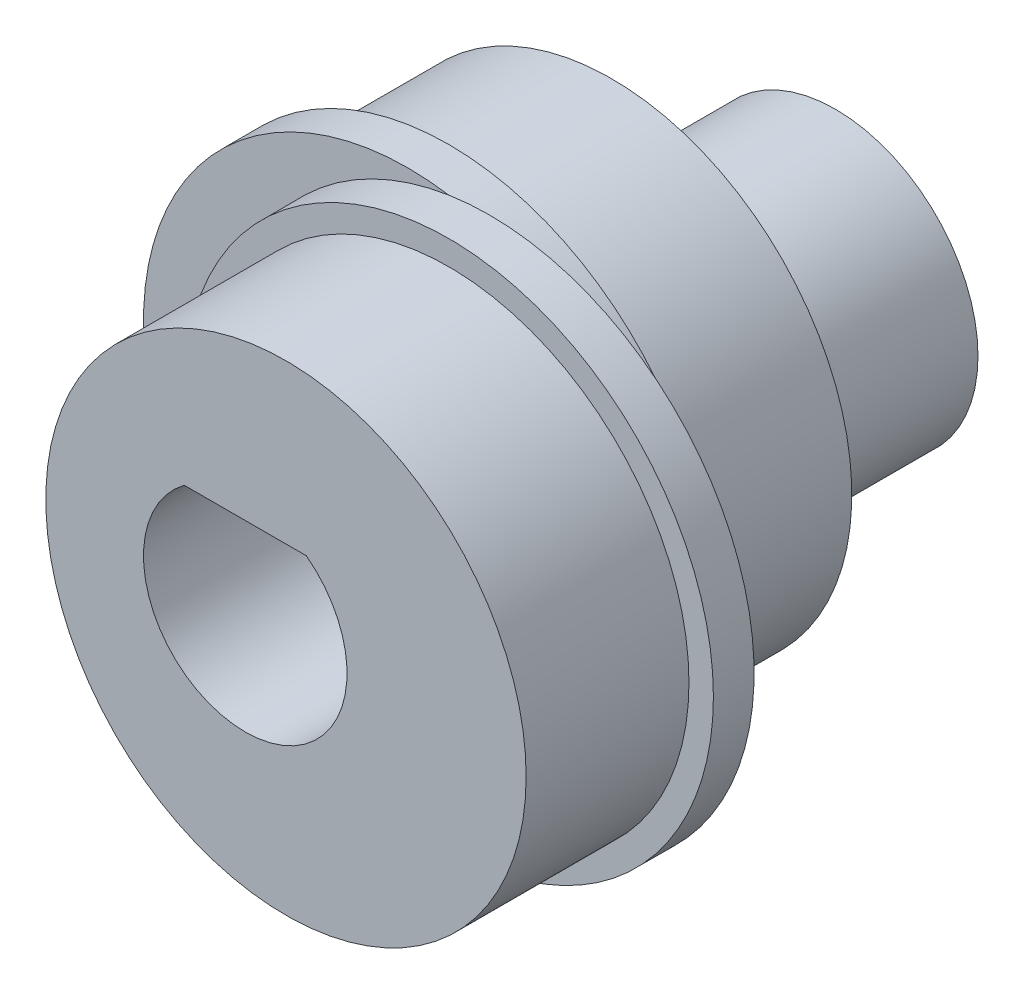
ISO-10303-21;
HEADER;
FILE_DESCRIPTION(('STEP AP214'),'2;1');
FILE_NAME('part.step','',(''),(''),'','','');
FILE_SCHEMA(('AUTOMOTIVE_DESIGN { 1 0 10303 214 1 1 1 1 }'));
ENDSEC;
DATA;
#1=APPLICATION_CONTEXT('core data for automotive mechanical design processes');
#2=APPLICATION_PROTOCOL_DEFINITION('international standard','automotive_design',2000,#1);
#3=PRODUCT_CONTEXT('',#1,'mechanical');
#4=PRODUCT('Part','Part','',(#3));
#5=PRODUCT_RELATED_PRODUCT_CATEGORY('part','',(#4));
#6=PRODUCT_DEFINITION_FORMATION('','',#4);
#7=PRODUCT_DEFINITION_CONTEXT('part definition',#1,'design');
#8=PRODUCT_DEFINITION('design','',#6,#7);
#9=PRODUCT_DEFINITION_SHAPE('','',#8);
#10=(LENGTH_UNIT() NAMED_UNIT(*) SI_UNIT(.MILLI.,.METRE.));
#11=(NAMED_UNIT(*) PLANE_ANGLE_UNIT() SI_UNIT($,.RADIAN.));
#12=(NAMED_UNIT(*) SI_UNIT($,.STERADIAN.) SOLID_ANGLE_UNIT());
#13=UNCERTAINTY_MEASURE_WITH_UNIT(LENGTH_MEASURE(1.E-05),#10,'distance_accuracy_value','');
#14=(GEOMETRIC_REPRESENTATION_CONTEXT(3) GLOBAL_UNCERTAINTY_ASSIGNED_CONTEXT((#13)) GLOBAL_UNIT_ASSIGNED_CONTEXT((#10,
#11,#12)) REPRESENTATION_CONTEXT('',''));
#15=CARTESIAN_POINT('',(0.,0.,0.));
#16=DIRECTION('',(0.,0.,1.));
#17=DIRECTION('',(1.,0.,0.));
#18=AXIS2_PLACEMENT_3D('',#15,#16,#17);
#19=CARTESIAN_POINT('',(0.,0.,10.));
#20=DIRECTION('',(0.,0.,1.));
#21=DIRECTION('',(1.,0.,0.));
#22=AXIS2_PLACEMENT_3D('',#19,#20,#21);
#23=PLANE('',#22);
#24=DIRECTION('',(-1.,0.,0.));
#25=VECTOR('',#24,1.);
#26=CARTESIAN_POINT('',(-1.5,2.,10.));
#27=LINE('',#26,#25);
#28=CARTESIAN_POINT('',(1.5,2.,10.));
#29=VERTEX_POINT('',#28);
#30=CARTESIAN_POINT('',(-1.5,2.,10.));
#31=VERTEX_POINT('',#30);
#32=EDGE_CURVE('E116',#29,#31,#27,.T.);
#33=ORIENTED_EDGE('',*,*,#32,.F.);
#34=CARTESIAN_POINT('',(0.,0.,10.));
#35=DIRECTION('',(0.,0.,1.));
#36=DIRECTION('',(1.,0.,0.));
#37=AXIS2_PLACEMENT_3D('',#34,#35,#36);
#38=CIRCLE('',#37,2.5);
#39=EDGE_CURVE('E75',#31,#29,#38,.T.);
#40=ORIENTED_EDGE('',*,*,#39,.F.);
#41=EDGE_LOOP('',(#33,#40));
#42=FACE_BOUND('',#41,.T.);
#43=CARTESIAN_POINT('',(1.,0.,10.));
#44=DIRECTION('',(0.,0.,1.));
#45=DIRECTION('',(1.,0.,0.));
#46=AXIS2_PLACEMENT_3D('',#43,#44,#45);
#47=CIRCLE('',#46,5.9);
#48=CARTESIAN_POINT('',(6.9,0.,10.));
#49=VERTEX_POINT('',#48);
#50=EDGE_CURVE('E92',#49,#49,#47,.T.);
#51=ORIENTED_EDGE('',*,*,#50,.T.);
#52=EDGE_LOOP('',(#51));
#53=FACE_BOUND('',#52,.T.);
#54=ADVANCED_FACE('F37',(#42,#53),#23,.T.);
#55=CARTESIAN_POINT('',(0.,0.,0.));
#56=DIRECTION('',(0.,0.,1.));
#57=DIRECTION('',(1.,0.,0.));
#58=AXIS2_PLACEMENT_3D('',#55,#56,#57);
#59=PLANE('',#58);
#60=CARTESIAN_POINT('',(0.,0.,0.));
#61=DIRECTION('',(0.,0.,1.));
#62=DIRECTION('',(1.,0.,0.));
#63=AXIS2_PLACEMENT_3D('',#60,#61,#62);
#64=CIRCLE('',#63,3.5);
#65=CARTESIAN_POINT('',(3.5,0.,0.));
#66=VERTEX_POINT('',#65);
#67=EDGE_CURVE('E80',#66,#66,#64,.T.);
#68=ORIENTED_EDGE('',*,*,#67,.T.);
#69=EDGE_LOOP('',(#68));
#70=FACE_BOUND('',#69,.T.);
#71=CARTESIAN_POINT('',(-1.,0.,0.));
#72=DIRECTION('',(0.,0.,-1.));
#73=DIRECTION('',(-1.,0.,0.));
#74=AXIS2_PLACEMENT_3D('',#71,#72,#73);
#75=CIRCLE('',#74,5.9);
#76=CARTESIAN_POINT('',(-6.9,0.,0.));
#77=VERTEX_POINT('',#76);
#78=EDGE_CURVE('E112',#77,#77,#75,.T.);
#79=ORIENTED_EDGE('',*,*,#78,.T.);
#80=EDGE_LOOP('',(#79));
#81=FACE_BOUND('',#80,.T.);
#82=ADVANCED_FACE('F39',(#70,#81),#59,.F.);
#83=CARTESIAN_POINT('',(0.,0.,10.));
#84=DIRECTION('',(0.,0.,-1.));
#85=DIRECTION('',(-1.,0.,0.));
#86=AXIS2_PLACEMENT_3D('',#83,#84,#85);
#87=CYLINDRICAL_SURFACE('',#86,2.5);
#88=DIRECTION('',(0.,0.,-1.));
#89=VECTOR('',#88,1.);
#90=CARTESIAN_POINT('',(1.5,2.,10.));
#91=LINE('',#90,#89);
#92=CARTESIAN_POINT('',(1.5,2.,-4.5));
#93=VERTEX_POINT('',#92);
#94=EDGE_CURVE('E11',#29,#93,#91,.T.);
#95=ORIENTED_EDGE('',*,*,#94,.T.);
#96=CARTESIAN_POINT('',(0.,0.,-4.5));
#97=DIRECTION('',(0.,0.,1.));
#98=DIRECTION('',(1.,0.,0.));
#99=AXIS2_PLACEMENT_3D('',#96,#97,#98);
#100=CIRCLE('',#99,2.5);
#101=CARTESIAN_POINT('',(-1.5,2.,-4.5));
#102=VERTEX_POINT('',#101);
#103=EDGE_CURVE('E72',#102,#93,#100,.T.);
#104=ORIENTED_EDGE('',*,*,#103,.F.);
#105=DIRECTION('',(0.,0.,-1.));
#106=VECTOR('',#105,1.);
#107=CARTESIAN_POINT('',(-1.5,2.,10.));
#108=LINE('',#107,#106);
#109=EDGE_CURVE('E45',#31,#102,#108,.T.);
#110=ORIENTED_EDGE('',*,*,#109,.F.);
#111=ORIENTED_EDGE('',*,*,#39,.T.);
#112=EDGE_LOOP('',(#95,#104,#110,#111));
#113=FACE_BOUND('',#112,.T.);
#114=ADVANCED_FACE('F69',(#113),#87,.F.);
#115=CARTESIAN_POINT('',(-1.5,2.,10.));
#116=DIRECTION('',(0.,-1.,0.));
#117=DIRECTION('',(0.,0.,-1.));
#118=AXIS2_PLACEMENT_3D('',#115,#116,#117);
#119=PLANE('',#118);
#120=ORIENTED_EDGE('',*,*,#109,.T.);
#121=DIRECTION('',(-1.,0.,0.));
#122=VECTOR('',#121,1.);
#123=CARTESIAN_POINT('',(-1.5,2.,-4.5));
#124=LINE('',#123,#122);
#125=EDGE_CURVE('E77',#93,#102,#124,.T.);
#126=ORIENTED_EDGE('',*,*,#125,.F.);
#127=ORIENTED_EDGE('',*,*,#94,.F.);
#128=ORIENTED_EDGE('',*,*,#32,.T.);
#129=EDGE_LOOP('',(#120,#126,#127,#128));
#130=FACE_BOUND('',#129,.T.);
#131=ADVANCED_FACE('F78',(#130),#119,.T.);
#132=CARTESIAN_POINT('',(-1.,0.,4.));
#133=DIRECTION('',(0.,0.,-1.));
#134=DIRECTION('',(-1.,0.,0.));
#135=AXIS2_PLACEMENT_3D('',#132,#133,#134);
#136=CYLINDRICAL_SURFACE('',#135,5.9);
#137=CARTESIAN_POINT('',(-1.,0.,4.));
#138=DIRECTION('',(0.,0.,1.));
#139=DIRECTION('',(1.,0.,0.));
#140=AXIS2_PLACEMENT_3D('',#137,#138,#139);
#141=CIRCLE('',#140,5.9);
#142=CARTESIAN_POINT('',(4.9,0.,4.));
#143=VERTEX_POINT('',#142);
#144=EDGE_CURVE('E107',#143,#143,#141,.F.);
#145=ORIENTED_EDGE('',*,*,#144,.T.);
#146=EDGE_LOOP('',(#145));
#147=FACE_BOUND('',#146,.T.);
#148=ORIENTED_EDGE('',*,*,#78,.F.);
#149=EDGE_LOOP('',(#148));
#150=FACE_BOUND('',#149,.T.);
#151=ADVANCED_FACE('F155',(#147,#150),#136,.T.);
#152=CARTESIAN_POINT('',(-1.,0.,5.));
#153=DIRECTION('',(0.,0.,1.));
#154=DIRECTION('',(1.,0.,0.));
#155=AXIS2_PLACEMENT_3D('',#152,#153,#154);
#156=PLANE('',#155);
#157=CARTESIAN_POINT('',(-1.,0.,5.));
#158=DIRECTION('',(0.,0.,1.));
#159=DIRECTION('',(1.,0.,0.));
#160=AXIS2_PLACEMENT_3D('',#157,#158,#159);
#161=CIRCLE('',#160,6.5);
#162=CARTESIAN_POINT('',(0.,6.42261628933257,5.));
#163=VERTEX_POINT('',#162);
#164=CARTESIAN_POINT('',(0.,-6.42261628933257,5.));
#165=VERTEX_POINT('',#164);
#166=EDGE_CURVE('E105',#163,#165,#161,.T.);
#167=ORIENTED_EDGE('',*,*,#166,.T.);
#168=CARTESIAN_POINT('',(1.,0.,5.));
#169=DIRECTION('',(0.,0.,1.));
#170=DIRECTION('',(1.,0.,0.));
#171=AXIS2_PLACEMENT_3D('',#168,#169,#170);
#172=CIRCLE('',#171,6.5);
#173=EDGE_CURVE('E102',#163,#165,#172,.T.);
#174=ORIENTED_EDGE('',*,*,#173,.F.);
#175=EDGE_LOOP('',(#167,#174));
#176=FACE_BOUND('',#175,.T.);
#177=ADVANCED_FACE('F145',(#176),#156,.T.);
#178=CARTESIAN_POINT('',(-1.,0.,4.));
#179=DIRECTION('',(0.,0.,1.));
#180=DIRECTION('',(1.,0.,0.));
#181=AXIS2_PLACEMENT_3D('',#178,#179,#180);
#182=PLANE('',#181);
#183=ORIENTED_EDGE('',*,*,#144,.F.);
#184=EDGE_LOOP('',(#183));
#185=FACE_BOUND('',#184,.T.);
#186=CARTESIAN_POINT('',(-1.,0.,4.));
#187=DIRECTION('',(0.,0.,1.));
#188=DIRECTION('',(1.,0.,0.));
#189=AXIS2_PLACEMENT_3D('',#186,#187,#188);
#190=CIRCLE('',#189,6.5);
#191=CARTESIAN_POINT('',(5.5,0.,4.));
#192=VERTEX_POINT('',#191);
#193=EDGE_CURVE('E101',#192,#192,#190,.T.);
#194=ORIENTED_EDGE('',*,*,#193,.F.);
#195=EDGE_LOOP('',(#194));
#196=FACE_BOUND('',#195,.T.);
#197=ADVANCED_FACE('F154',(#185,#196),#182,.F.);
#198=CARTESIAN_POINT('',(-1.,0.,5.));
#199=DIRECTION('',(0.,0.,-1.));
#200=DIRECTION('',(-1.,0.,0.));
#201=AXIS2_PLACEMENT_3D('',#198,#199,#200);
#202=CYLINDRICAL_SURFACE('',#201,6.5);
#203=ORIENTED_EDGE('',*,*,#166,.F.);
#204=EDGE_CURVE('E51',#165,#163,#161,.T.);
#205=ORIENTED_EDGE('',*,*,#204,.F.);
#206=EDGE_LOOP('',(#203,#205));
#207=FACE_BOUND('',#206,.T.);
#208=ORIENTED_EDGE('',*,*,#193,.T.);
#209=EDGE_LOOP('',(#208));
#210=FACE_BOUND('',#209,.T.);
#211=ADVANCED_FACE('F134',(#207,#210),#202,.T.);
#212=CARTESIAN_POINT('',(1.,0.,6.));
#213=DIRECTION('',(0.,0.,1.));
#214=DIRECTION('',(1.,0.,0.));
#215=AXIS2_PLACEMENT_3D('',#212,#213,#214);
#216=PLANE('',#215);
#217=CARTESIAN_POINT('',(1.,0.,6.));
#218=DIRECTION('',(0.,0.,1.));
#219=DIRECTION('',(1.,0.,0.));
#220=AXIS2_PLACEMENT_3D('',#217,#218,#219);
#221=CIRCLE('',#220,5.9);
#222=CARTESIAN_POINT('',(6.9,0.,6.));
#223=VERTEX_POINT('',#222);
#224=EDGE_CURVE('E89',#223,#223,#221,.T.);
#225=ORIENTED_EDGE('',*,*,#224,.F.);
#226=EDGE_LOOP('',(#225));
#227=FACE_BOUND('',#226,.T.);
#228=CARTESIAN_POINT('',(1.,0.,6.));
#229=DIRECTION('',(0.,0.,1.));
#230=DIRECTION('',(1.,0.,0.));
#231=AXIS2_PLACEMENT_3D('',#228,#229,#230);
#232=CIRCLE('',#231,6.5);
#233=CARTESIAN_POINT('',(7.5,0.,6.));
#234=VERTEX_POINT('',#233);
#235=EDGE_CURVE('E98',#234,#234,#232,.T.);
#236=ORIENTED_EDGE('',*,*,#235,.T.);
#237=EDGE_LOOP('',(#236));
#238=FACE_BOUND('',#237,.T.);
#239=ADVANCED_FACE('F130',(#227,#238),#216,.T.);
#240=CARTESIAN_POINT('',(1.,0.,5.));
#241=DIRECTION('',(0.,0.,1.));
#242=DIRECTION('',(1.,0.,0.));
#243=AXIS2_PLACEMENT_3D('',#240,#241,#242);
#244=PLANE('',#243);
#245=EDGE_CURVE('E95',#165,#163,#172,.T.);
#246=ORIENTED_EDGE('',*,*,#245,.F.);
#247=ORIENTED_EDGE('',*,*,#204,.T.);
#248=EDGE_LOOP('',(#246,#247));
#249=FACE_BOUND('',#248,.T.);
#250=ADVANCED_FACE('F133',(#249),#244,.F.);
#251=CARTESIAN_POINT('',(1.,0.,6.));
#252=DIRECTION('',(0.,0.,-1.));
#253=DIRECTION('',(-1.,0.,0.));
#254=AXIS2_PLACEMENT_3D('',#251,#252,#253);
#255=CYLINDRICAL_SURFACE('',#254,6.5);
#256=ORIENTED_EDGE('',*,*,#235,.F.);
#257=EDGE_LOOP('',(#256));
#258=FACE_BOUND('',#257,.T.);
#259=ORIENTED_EDGE('',*,*,#173,.T.);
#260=ORIENTED_EDGE('',*,*,#245,.T.);
#261=EDGE_LOOP('',(#259,#260));
#262=FACE_BOUND('',#261,.T.);
#263=ADVANCED_FACE('F126',(#258,#262),#255,.T.);
#264=CARTESIAN_POINT('',(1.,0.,10.));
#265=DIRECTION('',(0.,0.,-1.));
#266=DIRECTION('',(-1.,0.,0.));
#267=AXIS2_PLACEMENT_3D('',#264,#265,#266);
#268=CYLINDRICAL_SURFACE('',#267,5.9);
#269=ORIENTED_EDGE('',*,*,#50,.F.);
#270=EDGE_LOOP('',(#269));
#271=FACE_BOUND('',#270,.T.);
#272=ORIENTED_EDGE('',*,*,#224,.T.);
#273=EDGE_LOOP('',(#272));
#274=FACE_BOUND('',#273,.T.);
#275=ADVANCED_FACE('F122',(#271,#274),#268,.T.);
#276=CARTESIAN_POINT('',(0.,0.,-4.5));
#277=DIRECTION('',(0.,0.,1.));
#278=DIRECTION('',(1.,0.,0.));
#279=AXIS2_PLACEMENT_3D('',#276,#277,#278);
#280=CYLINDRICAL_SURFACE('',#279,3.5);
#281=CARTESIAN_POINT('',(0.,0.,-4.5));
#282=DIRECTION('',(0.,0.,1.));
#283=DIRECTION('',(1.,0.,0.));
#284=AXIS2_PLACEMENT_3D('',#281,#282,#283);
#285=CIRCLE('',#284,3.5);
#286=CARTESIAN_POINT('',(3.5,0.,-4.5));
#287=VERTEX_POINT('',#286);
#288=EDGE_CURVE('E86',#287,#287,#285,.T.);
#289=ORIENTED_EDGE('',*,*,#288,.T.);
#290=EDGE_LOOP('',(#289));
#291=FACE_BOUND('',#290,.T.);
#292=ORIENTED_EDGE('',*,*,#67,.F.);
#293=EDGE_LOOP('',(#292));
#294=FACE_BOUND('',#293,.T.);
#295=ADVANCED_FACE('F125',(#291,#294),#280,.T.);
#296=CARTESIAN_POINT('',(0.,0.,-4.5));
#297=DIRECTION('',(0.,0.,1.));
#298=DIRECTION('',(1.,0.,0.));
#299=AXIS2_PLACEMENT_3D('',#296,#297,#298);
#300=PLANE('',#299);
#301=ORIENTED_EDGE('',*,*,#125,.T.);
#302=ORIENTED_EDGE('',*,*,#103,.T.);
#303=EDGE_LOOP('',(#301,#302));
#304=FACE_BOUND('',#303,.T.);
#305=ORIENTED_EDGE('',*,*,#288,.F.);
#306=EDGE_LOOP('',(#305));
#307=FACE_BOUND('',#306,.T.);
#308=ADVANCED_FACE('F82',(#304,#307),#300,.F.);
#309=CLOSED_SHELL('',(#54,#82,#114,#131,#151,#177,#197,#211,#239,#250,#263,#275,#295,#308));
#310=MANIFOLD_SOLID_BREP('B2',#309);
#311=ADVANCED_BREP_SHAPE_REPRESENTATION('',(#18,#310),#14);
#312=SHAPE_DEFINITION_REPRESENTATION(#9,#311);
ENDSEC;
END-ISO-10303-21;
